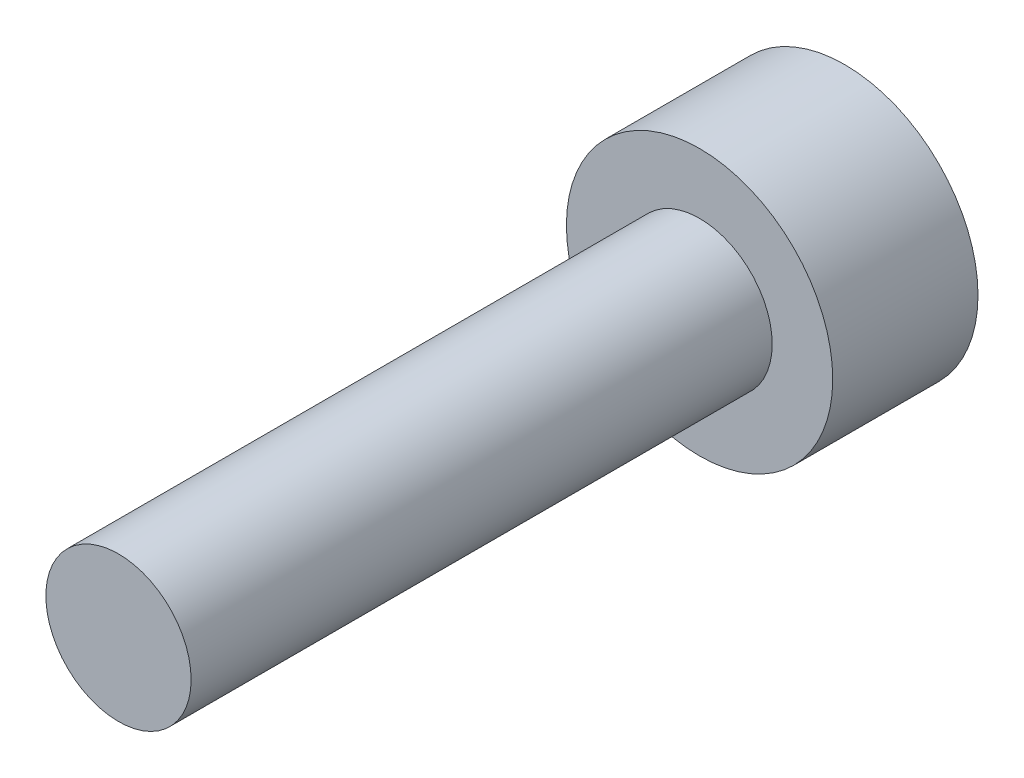
ISO-10303-21;
HEADER;
FILE_DESCRIPTION(('STEP AP214'),'2;1');
FILE_NAME('part.step','',(''),(''),'','','');
FILE_SCHEMA(('AUTOMOTIVE_DESIGN { 1 0 10303 214 1 1 1 1 }'));
ENDSEC;
DATA;
#1=APPLICATION_CONTEXT('core data for automotive mechanical design processes');
#2=APPLICATION_PROTOCOL_DEFINITION('international standard','automotive_design',2000,#1);
#3=PRODUCT_CONTEXT('',#1,'mechanical');
#4=PRODUCT('Part','Part','',(#3));
#5=PRODUCT_RELATED_PRODUCT_CATEGORY('part','',(#4));
#6=PRODUCT_DEFINITION_FORMATION('','',#4);
#7=PRODUCT_DEFINITION_CONTEXT('part definition',#1,'design');
#8=PRODUCT_DEFINITION('design','',#6,#7);
#9=PRODUCT_DEFINITION_SHAPE('','',#8);
#10=(LENGTH_UNIT() NAMED_UNIT(*) SI_UNIT(.MILLI.,.METRE.));
#11=(NAMED_UNIT(*) PLANE_ANGLE_UNIT() SI_UNIT($,.RADIAN.));
#12=(NAMED_UNIT(*) SI_UNIT($,.STERADIAN.) SOLID_ANGLE_UNIT());
#13=UNCERTAINTY_MEASURE_WITH_UNIT(LENGTH_MEASURE(1.E-05),#10,'distance_accuracy_value','');
#14=(GEOMETRIC_REPRESENTATION_CONTEXT(3) GLOBAL_UNCERTAINTY_ASSIGNED_CONTEXT((#13)) GLOBAL_UNIT_ASSIGNED_CONTEXT((#10,
#11,#12)) REPRESENTATION_CONTEXT('',''));
#15=CARTESIAN_POINT('',(0.,0.,0.));
#16=DIRECTION('',(0.,0.,1.));
#17=DIRECTION('',(1.,0.,0.));
#18=AXIS2_PLACEMENT_3D('',#15,#16,#17);
#19=CARTESIAN_POINT('',(0.,0.,-3.));
#20=DIRECTION('',(0.,0.,1.));
#21=DIRECTION('',(1.,0.,0.));
#22=AXIS2_PLACEMENT_3D('',#19,#20,#21);
#23=PLANE('',#22);
#24=CARTESIAN_POINT('',(0.,0.,-3.));
#25=DIRECTION('',(0.,0.,1.));
#26=DIRECTION('',(1.,0.,0.));
#27=AXIS2_PLACEMENT_3D('',#24,#25,#26);
#28=CIRCLE('',#27,2.75);
#29=CARTESIAN_POINT('',(2.75,0.,-3.));
#30=VERTEX_POINT('',#29);
#31=EDGE_CURVE('E47',#30,#30,#28,.T.);
#32=ORIENTED_EDGE('',*,*,#31,.F.);
#33=EDGE_LOOP('',(#32));
#34=FACE_BOUND('',#33,.T.);
#35=DIRECTION('',(0.5,0.866025403784439,0.));
#36=VECTOR('',#35,1.);
#37=CARTESIAN_POINT('',(0.721687836487032,-1.25,-3.));
#38=LINE('',#37,#36);
#39=CARTESIAN_POINT('',(0.721687836487032,-1.25,-3.));
#40=VERTEX_POINT('',#39);
#41=CARTESIAN_POINT('',(1.44337567297406,0.,-3.));
#42=VERTEX_POINT('',#41);
#43=EDGE_CURVE('E62',#40,#42,#38,.T.);
#44=ORIENTED_EDGE('',*,*,#43,.T.);
#45=DIRECTION('',(-0.5,0.866025403784439,0.));
#46=VECTOR('',#45,1.);
#47=CARTESIAN_POINT('',(1.44337567297406,0.,-3.));
#48=LINE('',#47,#46);
#49=CARTESIAN_POINT('',(0.721687836487032,1.25,-3.));
#50=VERTEX_POINT('',#49);
#51=EDGE_CURVE('E138',#42,#50,#48,.T.);
#52=ORIENTED_EDGE('',*,*,#51,.T.);
#53=DIRECTION('',(-1.,0.,0.));
#54=VECTOR('',#53,1.);
#55=CARTESIAN_POINT('',(0.721687836487032,1.25,-3.));
#56=LINE('',#55,#54);
#57=CARTESIAN_POINT('',(-0.721687836487032,1.25,-3.));
#58=VERTEX_POINT('',#57);
#59=EDGE_CURVE('E141',#50,#58,#56,.T.);
#60=ORIENTED_EDGE('',*,*,#59,.T.);
#61=DIRECTION('',(-0.5,-0.866025403784439,0.));
#62=VECTOR('',#61,1.);
#63=CARTESIAN_POINT('',(-0.721687836487032,1.25,-3.));
#64=LINE('',#63,#62);
#65=CARTESIAN_POINT('',(-1.44337567297406,0.,-3.));
#66=VERTEX_POINT('',#65);
#67=EDGE_CURVE('E150',#58,#66,#64,.T.);
#68=ORIENTED_EDGE('',*,*,#67,.T.);
#69=DIRECTION('',(0.5,-0.866025403784439,0.));
#70=VECTOR('',#69,1.);
#71=CARTESIAN_POINT('',(-1.44337567297406,0.,-3.));
#72=LINE('',#71,#70);
#73=CARTESIAN_POINT('',(-0.721687836487033,-1.25,-3.));
#74=VERTEX_POINT('',#73);
#75=EDGE_CURVE('E125',#66,#74,#72,.T.);
#76=ORIENTED_EDGE('',*,*,#75,.T.);
#77=DIRECTION('',(1.,0.,0.));
#78=VECTOR('',#77,1.);
#79=CARTESIAN_POINT('',(-0.721687836487033,-1.25,-3.));
#80=LINE('',#79,#78);
#81=EDGE_CURVE('E155',#74,#40,#80,.T.);
#82=ORIENTED_EDGE('',*,*,#81,.T.);
#83=EDGE_LOOP('',(#44,#52,#60,#68,#76,#82));
#84=FACE_BOUND('',#83,.T.);
#85=ADVANCED_FACE('F44',(#34,#84),#23,.F.);
#86=CARTESIAN_POINT('',(0.,0.,0.));
#87=DIRECTION('',(0.,0.,-1.));
#88=DIRECTION('',(-1.,0.,0.));
#89=AXIS2_PLACEMENT_3D('',#86,#87,#88);
#90=CYLINDRICAL_SURFACE('',#89,2.75);
#91=CARTESIAN_POINT('',(0.,0.,0.));
#92=DIRECTION('',(0.,0.,1.));
#93=DIRECTION('',(1.,0.,0.));
#94=AXIS2_PLACEMENT_3D('',#91,#92,#93);
#95=CIRCLE('',#94,2.75);
#96=CARTESIAN_POINT('',(2.75,0.,0.));
#97=VERTEX_POINT('',#96);
#98=EDGE_CURVE('E54',#97,#97,#95,.T.);
#99=ORIENTED_EDGE('',*,*,#98,.F.);
#100=EDGE_LOOP('',(#99));
#101=FACE_BOUND('',#100,.T.);
#102=ORIENTED_EDGE('',*,*,#31,.T.);
#103=EDGE_LOOP('',(#102));
#104=FACE_BOUND('',#103,.T.);
#105=ADVANCED_FACE('F50',(#101,#104),#90,.T.);
#106=CARTESIAN_POINT('',(0.,0.,0.));
#107=DIRECTION('',(0.,0.,1.));
#108=DIRECTION('',(1.,0.,0.));
#109=AXIS2_PLACEMENT_3D('',#106,#107,#108);
#110=PLANE('',#109);
#111=CARTESIAN_POINT('',(0.,0.,0.));
#112=DIRECTION('',(0.,0.,1.));
#113=DIRECTION('',(1.,0.,0.));
#114=AXIS2_PLACEMENT_3D('',#111,#112,#113);
#115=CIRCLE('',#114,1.5);
#116=CARTESIAN_POINT('',(1.5,0.,0.));
#117=VERTEX_POINT('',#116);
#118=EDGE_CURVE('E11',#117,#117,#115,.T.);
#119=ORIENTED_EDGE('',*,*,#118,.F.);
#120=EDGE_LOOP('',(#119));
#121=FACE_BOUND('',#120,.T.);
#122=ORIENTED_EDGE('',*,*,#98,.T.);
#123=EDGE_LOOP('',(#122));
#124=FACE_BOUND('',#123,.T.);
#125=ADVANCED_FACE('F212',(#121,#124),#110,.T.);
#126=CARTESIAN_POINT('',(0.,0.,12.));
#127=DIRECTION('',(0.,0.,-1.));
#128=DIRECTION('',(-1.,0.,0.));
#129=AXIS2_PLACEMENT_3D('',#126,#127,#128);
#130=CYLINDRICAL_SURFACE('',#129,1.5);
#131=CARTESIAN_POINT('',(0.,0.,12.));
#132=DIRECTION('',(0.,0.,1.));
#133=DIRECTION('',(1.,0.,0.));
#134=AXIS2_PLACEMENT_3D('',#131,#132,#133);
#135=CIRCLE('',#134,1.5);
#136=CARTESIAN_POINT('',(1.5,0.,12.));
#137=VERTEX_POINT('',#136);
#138=EDGE_CURVE('E166',#137,#137,#135,.T.);
#139=ORIENTED_EDGE('',*,*,#138,.F.);
#140=EDGE_LOOP('',(#139));
#141=FACE_BOUND('',#140,.T.);
#142=ORIENTED_EDGE('',*,*,#118,.T.);
#143=EDGE_LOOP('',(#142));
#144=FACE_BOUND('',#143,.T.);
#145=ADVANCED_FACE('F209',(#141,#144),#130,.T.);
#146=CARTESIAN_POINT('',(0.,0.,12.));
#147=DIRECTION('',(0.,0.,1.));
#148=DIRECTION('',(1.,0.,0.));
#149=AXIS2_PLACEMENT_3D('',#146,#147,#148);
#150=PLANE('',#149);
#151=ORIENTED_EDGE('',*,*,#138,.T.);
#152=EDGE_LOOP('',(#151));
#153=FACE_BOUND('',#152,.T.);
#154=ADVANCED_FACE('F204',(#153),#150,.T.);
#155=CARTESIAN_POINT('',(0.721687836487032,-1.25,-1.7));
#156=DIRECTION('',(-0.866025403784439,0.5,0.));
#157=DIRECTION('',(-0.5,-0.866025403784439,0.));
#158=AXIS2_PLACEMENT_3D('',#155,#156,#157);
#159=PLANE('',#158);
#160=ORIENTED_EDGE('',*,*,#43,.F.);
#161=DIRECTION('',(0.,0.,-1.));
#162=VECTOR('',#161,1.);
#163=CARTESIAN_POINT('',(0.721687836487032,-1.25,-1.7));
#164=LINE('',#163,#162);
#165=CARTESIAN_POINT('',(0.721687836487032,-1.25,-1.7));
#166=VERTEX_POINT('',#165);
#167=EDGE_CURVE('E132',#166,#40,#164,.T.);
#168=ORIENTED_EDGE('',*,*,#167,.F.);
#169=DIRECTION('',(0.5,0.866025403784439,0.));
#170=VECTOR('',#169,1.);
#171=CARTESIAN_POINT('',(0.721687836487032,-1.25,-1.7));
#172=LINE('',#171,#170);
#173=CARTESIAN_POINT('',(1.44337567297406,0.,-1.7));
#174=VERTEX_POINT('',#173);
#175=EDGE_CURVE('E156',#166,#174,#172,.T.);
#176=ORIENTED_EDGE('',*,*,#175,.T.);
#177=DIRECTION('',(0.,0.,-1.));
#178=VECTOR('',#177,1.);
#179=CARTESIAN_POINT('',(1.44337567297406,0.,-1.7));
#180=LINE('',#179,#178);
#181=EDGE_CURVE('E167',#174,#42,#180,.T.);
#182=ORIENTED_EDGE('',*,*,#181,.T.);
#183=EDGE_LOOP('',(#160,#168,#176,#182));
#184=FACE_BOUND('',#183,.T.);
#185=ADVANCED_FACE('F184',(#184),#159,.T.);
#186=CARTESIAN_POINT('',(1.44337567297406,0.,-1.7));
#187=DIRECTION('',(-0.866025403784439,-0.5,0.));
#188=DIRECTION('',(0.5,-0.866025403784439,0.));
#189=AXIS2_PLACEMENT_3D('',#186,#187,#188);
#190=PLANE('',#189);
#191=ORIENTED_EDGE('',*,*,#51,.F.);
#192=ORIENTED_EDGE('',*,*,#181,.F.);
#193=DIRECTION('',(-0.5,0.866025403784439,0.));
#194=VECTOR('',#193,1.);
#195=CARTESIAN_POINT('',(1.44337567297406,0.,-1.7));
#196=LINE('',#195,#194);
#197=CARTESIAN_POINT('',(0.721687836487032,1.25,-1.7));
#198=VERTEX_POINT('',#197);
#199=EDGE_CURVE('E105',#174,#198,#196,.T.);
#200=ORIENTED_EDGE('',*,*,#199,.T.);
#201=DIRECTION('',(0.,0.,-1.));
#202=VECTOR('',#201,1.);
#203=CARTESIAN_POINT('',(0.721687836487032,1.25,-1.7));
#204=LINE('',#203,#202);
#205=EDGE_CURVE('E162',#198,#50,#204,.T.);
#206=ORIENTED_EDGE('',*,*,#205,.T.);
#207=EDGE_LOOP('',(#191,#192,#200,#206));
#208=FACE_BOUND('',#207,.T.);
#209=ADVANCED_FACE('F198',(#208),#190,.T.);
#210=CARTESIAN_POINT('',(0.721687836487032,1.25,-1.7));
#211=DIRECTION('',(0.,-1.,0.));
#212=DIRECTION('',(1.,0.,0.));
#213=AXIS2_PLACEMENT_3D('',#210,#211,#212);
#214=PLANE('',#213);
#215=ORIENTED_EDGE('',*,*,#59,.F.);
#216=ORIENTED_EDGE('',*,*,#205,.F.);
#217=DIRECTION('',(-1.,0.,0.));
#218=VECTOR('',#217,1.);
#219=CARTESIAN_POINT('',(0.721687836487032,1.25,-1.7));
#220=LINE('',#219,#218);
#221=CARTESIAN_POINT('',(-0.721687836487032,1.25,-1.7));
#222=VERTEX_POINT('',#221);
#223=EDGE_CURVE('E121',#198,#222,#220,.T.);
#224=ORIENTED_EDGE('',*,*,#223,.T.);
#225=DIRECTION('',(0.,0.,-1.));
#226=VECTOR('',#225,1.);
#227=CARTESIAN_POINT('',(-0.721687836487032,1.25,-1.7));
#228=LINE('',#227,#226);
#229=EDGE_CURVE('E119',#222,#58,#228,.T.);
#230=ORIENTED_EDGE('',*,*,#229,.T.);
#231=EDGE_LOOP('',(#215,#216,#224,#230));
#232=FACE_BOUND('',#231,.T.);
#233=ADVANCED_FACE('F193',(#232),#214,.T.);
#234=CARTESIAN_POINT('',(-0.721687836487032,1.25,-1.7));
#235=DIRECTION('',(0.866025403784439,-0.5,0.));
#236=DIRECTION('',(0.5,0.866025403784439,0.));
#237=AXIS2_PLACEMENT_3D('',#234,#235,#236);
#238=PLANE('',#237);
#239=ORIENTED_EDGE('',*,*,#67,.F.);
#240=ORIENTED_EDGE('',*,*,#229,.F.);
#241=DIRECTION('',(-0.5,-0.866025403784439,0.));
#242=VECTOR('',#241,1.);
#243=CARTESIAN_POINT('',(-0.721687836487032,1.25,-1.7));
#244=LINE('',#243,#242);
#245=CARTESIAN_POINT('',(-1.44337567297406,0.,-1.7));
#246=VERTEX_POINT('',#245);
#247=EDGE_CURVE('E115',#222,#246,#244,.T.);
#248=ORIENTED_EDGE('',*,*,#247,.T.);
#249=DIRECTION('',(0.,0.,-1.));
#250=VECTOR('',#249,1.);
#251=CARTESIAN_POINT('',(-1.44337567297406,0.,-1.7));
#252=LINE('',#251,#250);
#253=EDGE_CURVE('E118',#246,#66,#252,.T.);
#254=ORIENTED_EDGE('',*,*,#253,.T.);
#255=EDGE_LOOP('',(#239,#240,#248,#254));
#256=FACE_BOUND('',#255,.T.);
#257=ADVANCED_FACE('F113',(#256),#238,.T.);
#258=CARTESIAN_POINT('',(-1.44337567297406,0.,-1.7));
#259=DIRECTION('',(0.866025403784439,0.5,0.));
#260=DIRECTION('',(-0.5,0.866025403784439,0.));
#261=AXIS2_PLACEMENT_3D('',#258,#259,#260);
#262=PLANE('',#261);
#263=ORIENTED_EDGE('',*,*,#75,.F.);
#264=ORIENTED_EDGE('',*,*,#253,.F.);
#265=DIRECTION('',(0.5,-0.866025403784439,0.));
#266=VECTOR('',#265,1.);
#267=CARTESIAN_POINT('',(-1.44337567297406,0.,-1.7));
#268=LINE('',#267,#266);
#269=CARTESIAN_POINT('',(-0.721687836487033,-1.25,-1.7));
#270=VERTEX_POINT('',#269);
#271=EDGE_CURVE('E116',#246,#270,#268,.T.);
#272=ORIENTED_EDGE('',*,*,#271,.T.);
#273=DIRECTION('',(0.,0.,-1.));
#274=VECTOR('',#273,1.);
#275=CARTESIAN_POINT('',(-0.721687836487033,-1.25,-1.7));
#276=LINE('',#275,#274);
#277=EDGE_CURVE('E91',#270,#74,#276,.T.);
#278=ORIENTED_EDGE('',*,*,#277,.T.);
#279=EDGE_LOOP('',(#263,#264,#272,#278));
#280=FACE_BOUND('',#279,.T.);
#281=ADVANCED_FACE('F124',(#280),#262,.T.);
#282=CARTESIAN_POINT('',(-0.721687836487033,-1.25,-1.7));
#283=DIRECTION('',(0.,1.,0.));
#284=DIRECTION('',(-1.,0.,0.));
#285=AXIS2_PLACEMENT_3D('',#282,#283,#284);
#286=PLANE('',#285);
#287=ORIENTED_EDGE('',*,*,#81,.F.);
#288=ORIENTED_EDGE('',*,*,#277,.F.);
#289=DIRECTION('',(1.,0.,0.));
#290=VECTOR('',#289,1.);
#291=CARTESIAN_POINT('',(-0.721687836487033,-1.25,-1.7));
#292=LINE('',#291,#290);
#293=EDGE_CURVE('E72',#270,#166,#292,.T.);
#294=ORIENTED_EDGE('',*,*,#293,.T.);
#295=ORIENTED_EDGE('',*,*,#167,.T.);
#296=EDGE_LOOP('',(#287,#288,#294,#295));
#297=FACE_BOUND('',#296,.T.);
#298=ADVANCED_FACE('F181',(#297),#286,.T.);
#299=CARTESIAN_POINT('',(0.,0.,-1.7));
#300=DIRECTION('',(0.,0.,1.));
#301=DIRECTION('',(1.,0.,0.));
#302=AXIS2_PLACEMENT_3D('',#299,#300,#301);
#303=PLANE('',#302);
#304=ORIENTED_EDGE('',*,*,#175,.F.);
#305=ORIENTED_EDGE('',*,*,#293,.F.);
#306=ORIENTED_EDGE('',*,*,#271,.F.);
#307=ORIENTED_EDGE('',*,*,#247,.F.);
#308=ORIENTED_EDGE('',*,*,#223,.F.);
#309=ORIENTED_EDGE('',*,*,#199,.F.);
#310=EDGE_LOOP('',(#304,#305,#306,#307,#308,#309));
#311=FACE_BOUND('',#310,.T.);
#312=ADVANCED_FACE('F129',(#311),#303,.F.);
#313=CLOSED_SHELL('',(#85,#105,#125,#145,#154,#185,#209,#233,#257,#281,#298,#312));
#314=MANIFOLD_SOLID_BREP('B2',#313);
#315=ADVANCED_BREP_SHAPE_REPRESENTATION('',(#18,#314),#14);
#316=SHAPE_DEFINITION_REPRESENTATION(#9,#315);
ENDSEC;
END-ISO-10303-21;
